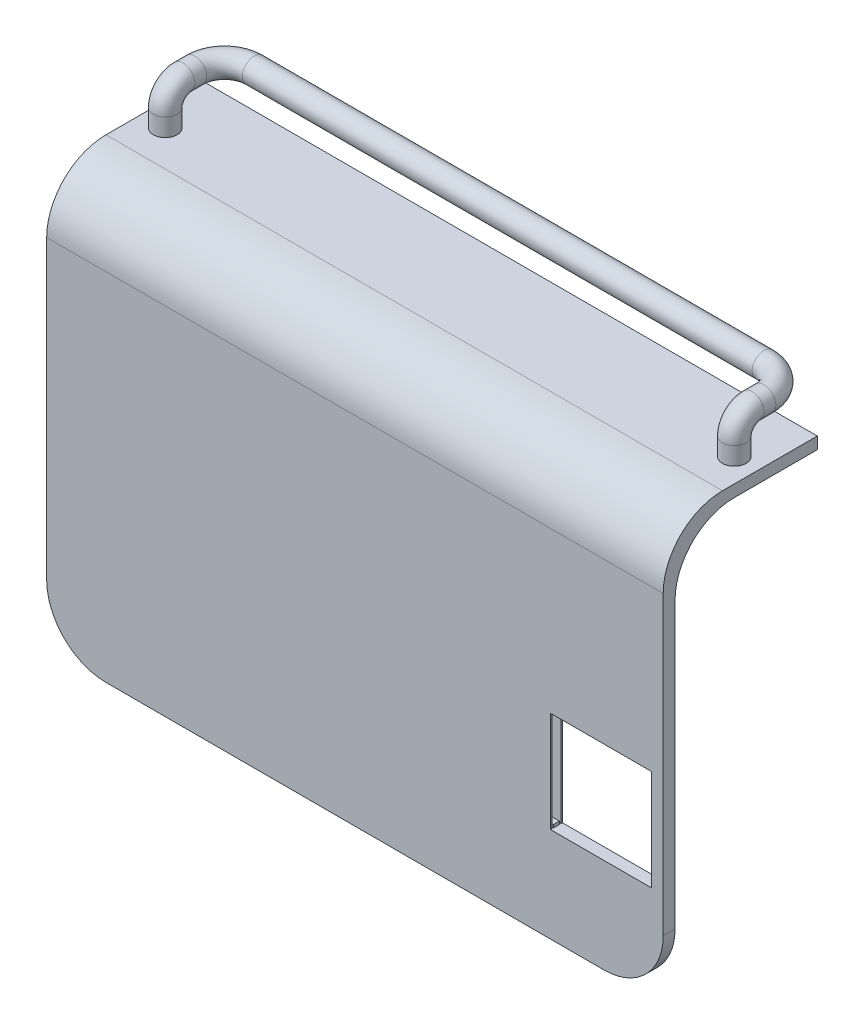
ISO-10303-21;
HEADER;
FILE_DESCRIPTION(('STEP AP214'),'2;1');
FILE_NAME('part.step','',(''),(''),'','','');
FILE_SCHEMA(('AUTOMOTIVE_DESIGN { 1 0 10303 214 1 1 1 1 }'));
ENDSEC;
DATA;
#1=APPLICATION_CONTEXT('core data for automotive mechanical design processes');
#2=APPLICATION_PROTOCOL_DEFINITION('international standard','automotive_design',2000,#1);
#3=PRODUCT_CONTEXT('',#1,'mechanical');
#4=PRODUCT('Part','Part','',(#3));
#5=PRODUCT_RELATED_PRODUCT_CATEGORY('part','',(#4));
#6=PRODUCT_DEFINITION_FORMATION('','',#4);
#7=PRODUCT_DEFINITION_CONTEXT('part definition',#1,'design');
#8=PRODUCT_DEFINITION('design','',#6,#7);
#9=PRODUCT_DEFINITION_SHAPE('','',#8);
#10=(LENGTH_UNIT() NAMED_UNIT(*) SI_UNIT(.MILLI.,.METRE.));
#11=(NAMED_UNIT(*) PLANE_ANGLE_UNIT() SI_UNIT($,.RADIAN.));
#12=(NAMED_UNIT(*) SI_UNIT($,.STERADIAN.) SOLID_ANGLE_UNIT());
#13=UNCERTAINTY_MEASURE_WITH_UNIT(LENGTH_MEASURE(1.E-05),#10,'distance_accuracy_value','');
#14=(GEOMETRIC_REPRESENTATION_CONTEXT(3) GLOBAL_UNCERTAINTY_ASSIGNED_CONTEXT((#13)) GLOBAL_UNIT_ASSIGNED_CONTEXT((#10,
#11,#12)) REPRESENTATION_CONTEXT('',''));
#15=CARTESIAN_POINT('',(0.,0.,0.));
#16=DIRECTION('',(0.,0.,1.));
#17=DIRECTION('',(1.,0.,0.));
#18=AXIS2_PLACEMENT_3D('',#15,#16,#17);
#19=CARTESIAN_POINT('',(330.,0.,240.));
#20=DIRECTION('',(1.,0.,0.));
#21=DIRECTION('',(0.,0.,-1.));
#22=AXIS2_PLACEMENT_3D('',#19,#20,#21);
#23=PLANE('',#22);
#24=DIRECTION('',(0.,1.,0.));
#25=VECTOR('',#24,1.);
#26=CARTESIAN_POINT('',(330.,-600.,242.5));
#27=LINE('',#26,#25);
#28=CARTESIAN_POINT('',(330.,-600.,242.5));
#29=VERTEX_POINT('',#28);
#30=CARTESIAN_POINT('',(330.,-430.,242.5));
#31=VERTEX_POINT('',#30);
#32=EDGE_CURVE('E49',#29,#31,#27,.T.);
#33=ORIENTED_EDGE('',*,*,#32,.F.);
#34=DIRECTION('',(0.,0.,1.));
#35=VECTOR('',#34,1.);
#36=CARTESIAN_POINT('',(330.,-600.,240.));
#37=LINE('',#36,#35);
#38=CARTESIAN_POINT('',(330.,-600.,240.));
#39=VERTEX_POINT('',#38);
#40=EDGE_CURVE('E343',#39,#29,#37,.T.);
#41=ORIENTED_EDGE('',*,*,#40,.F.);
#42=DIRECTION('',(0.,1.,0.));
#43=VECTOR('',#42,1.);
#44=CARTESIAN_POINT('',(330.,0.,240.));
#45=LINE('',#44,#43);
#46=CARTESIAN_POINT('',(330.,-430.,240.));
#47=VERTEX_POINT('',#46);
#48=EDGE_CURVE('E330',#39,#47,#45,.T.);
#49=ORIENTED_EDGE('',*,*,#48,.T.);
#50=DIRECTION('',(0.,0.,1.));
#51=VECTOR('',#50,1.);
#52=CARTESIAN_POINT('',(330.,-430.,240.));
#53=LINE('',#52,#51);
#54=EDGE_CURVE('E349',#47,#31,#53,.T.);
#55=ORIENTED_EDGE('',*,*,#54,.T.);
#56=EDGE_LOOP('',(#33,#41,#49,#55));
#57=FACE_BOUND('',#56,.T.);
#58=ADVANCED_FACE('F34',(#57),#23,.T.);
#59=DIRECTION('',(0.,-1.,0.));
#60=VECTOR('',#59,1.);
#61=CARTESIAN_POINT('',(330.,-595.,245.));
#62=LINE('',#61,#60);
#63=CARTESIAN_POINT('',(330.,-595.,245.));
#64=VERTEX_POINT('',#63);
#65=CARTESIAN_POINT('',(330.,-600.,245.));
#66=VERTEX_POINT('',#65);
#67=EDGE_CURVE('E244',#64,#66,#62,.T.);
#68=ORIENTED_EDGE('',*,*,#67,.F.);
#69=DIRECTION('',(0.,0.,-1.));
#70=VECTOR('',#69,1.);
#71=CARTESIAN_POINT('',(330.,-595.,255.));
#72=LINE('',#71,#70);
#73=CARTESIAN_POINT('',(330.,-595.,255.));
#74=VERTEX_POINT('',#73);
#75=EDGE_CURVE('E284',#74,#64,#72,.T.);
#76=ORIENTED_EDGE('',*,*,#75,.F.);
#77=DIRECTION('',(0.,1.,0.));
#78=VECTOR('',#77,1.);
#79=CARTESIAN_POINT('',(330.,-600.,255.));
#80=LINE('',#79,#78);
#81=CARTESIAN_POINT('',(330.,-600.,255.));
#82=VERTEX_POINT('',#81);
#83=EDGE_CURVE('E281',#82,#74,#80,.T.);
#84=ORIENTED_EDGE('',*,*,#83,.F.);
#85=EDGE_CURVE('E347',#66,#82,#37,.T.);
#86=ORIENTED_EDGE('',*,*,#85,.F.);
#87=EDGE_LOOP('',(#68,#76,#84,#86));
#88=FACE_BOUND('',#87,.T.);
#89=ADVANCED_FACE('F527',(#88),#23,.T.);
#90=DIRECTION('',(0.,-1.,0.));
#91=VECTOR('',#90,1.);
#92=CARTESIAN_POINT('',(330.,-430.,257.5));
#93=LINE('',#92,#91);
#94=CARTESIAN_POINT('',(330.,-430.,257.5));
#95=VERTEX_POINT('',#94);
#96=CARTESIAN_POINT('',(330.,-600.,257.5));
#97=VERTEX_POINT('',#96);
#98=EDGE_CURVE('E278',#95,#97,#93,.T.);
#99=ORIENTED_EDGE('',*,*,#98,.F.);
#100=CARTESIAN_POINT('',(330.,-430.,260.));
#101=VERTEX_POINT('',#100);
#102=EDGE_CURVE('E353',#95,#101,#53,.T.);
#103=ORIENTED_EDGE('',*,*,#102,.T.);
#104=DIRECTION('',(0.,1.,0.));
#105=VECTOR('',#104,1.);
#106=CARTESIAN_POINT('',(330.,0.,260.));
#107=LINE('',#106,#105);
#108=CARTESIAN_POINT('',(330.,-600.,260.));
#109=VERTEX_POINT('',#108);
#110=EDGE_CURVE('E325',#109,#101,#107,.T.);
#111=ORIENTED_EDGE('',*,*,#110,.F.);
#112=EDGE_CURVE('E348',#97,#109,#37,.T.);
#113=ORIENTED_EDGE('',*,*,#112,.F.);
#114=EDGE_LOOP('',(#99,#103,#111,#113));
#115=FACE_BOUND('',#114,.T.);
#116=ADVANCED_FACE('F535',(#115),#23,.T.);
#117=CARTESIAN_POINT('',(520.,-730.,240.));
#118=DIRECTION('',(0.,0.,1.));
#119=DIRECTION('',(1.,0.,0.));
#120=AXIS2_PLACEMENT_3D('',#117,#118,#119);
#121=PLANE('',#120);
#122=DIRECTION('',(-1.,0.,0.));
#123=VECTOR('',#122,1.);
#124=CARTESIAN_POINT('',(0.,-600.,240.));
#125=LINE('',#124,#123);
#126=CARTESIAN_POINT('',(500.,-600.,240.));
#127=VERTEX_POINT('',#126);
#128=EDGE_CURVE('E322',#127,#39,#125,.T.);
#129=ORIENTED_EDGE('',*,*,#128,.F.);
#130=DIRECTION('',(0.,-1.,0.));
#131=VECTOR('',#130,1.);
#132=CARTESIAN_POINT('',(500.,0.,240.));
#133=LINE('',#132,#131);
#134=CARTESIAN_POINT('',(500.,-430.,240.));
#135=VERTEX_POINT('',#134);
#136=EDGE_CURVE('E324',#135,#127,#133,.T.);
#137=ORIENTED_EDGE('',*,*,#136,.F.);
#138=DIRECTION('',(1.,0.,0.));
#139=VECTOR('',#138,1.);
#140=CARTESIAN_POINT('',(0.,-430.,240.));
#141=LINE('',#140,#139);
#142=EDGE_CURVE('E327',#47,#135,#141,.T.);
#143=ORIENTED_EDGE('',*,*,#142,.F.);
#144=ORIENTED_EDGE('',*,*,#48,.F.);
#145=EDGE_LOOP('',(#129,#137,#143,#144));
#146=FACE_BOUND('',#145,.T.);
#147=DIRECTION('',(1.,0.,0.));
#148=VECTOR('',#147,1.);
#149=CARTESIAN_POINT('',(520.,-730.,240.));
#150=LINE('',#149,#148);
#151=CARTESIAN_POINT('',(-491.414284285429,-730.,240.));
#152=VERTEX_POINT('',#151);
#153=CARTESIAN_POINT('',(491.414284285429,-730.,240.));
#154=VERTEX_POINT('',#153);
#155=EDGE_CURVE('E364',#152,#154,#150,.T.);
#156=ORIENTED_EDGE('',*,*,#155,.F.);
#157=CARTESIAN_POINT('',(-420.,-660.,240.));
#158=DIRECTION('',(0.,0.,1.));
#159=DIRECTION('',(1.,0.,0.));
#160=AXIS2_PLACEMENT_3D('',#157,#158,#159);
#161=CIRCLE('',#160,100.);
#162=CARTESIAN_POINT('',(-520.,-660.,240.));
#163=VERTEX_POINT('',#162);
#164=EDGE_CURVE('E453',#152,#163,#161,.F.);
#165=ORIENTED_EDGE('',*,*,#164,.T.);
#166=DIRECTION('',(0.,1.,0.));
#167=VECTOR('',#166,1.);
#168=CARTESIAN_POINT('',(-520.,-730.,240.));
#169=LINE('',#168,#167);
#170=CARTESIAN_POINT('',(-520.,-180.,240.));
#171=VERTEX_POINT('',#170);
#172=EDGE_CURVE('E371',#163,#171,#169,.T.);
#173=ORIENTED_EDGE('',*,*,#172,.T.);
#174=DIRECTION('',(-1.,0.,0.));
#175=VECTOR('',#174,1.);
#176=CARTESIAN_POINT('',(520.,-180.,240.));
#177=LINE('',#176,#175);
#178=CARTESIAN_POINT('',(520.,-180.,240.));
#179=VERTEX_POINT('',#178);
#180=EDGE_CURVE('E314',#179,#171,#177,.T.);
#181=ORIENTED_EDGE('',*,*,#180,.F.);
#182=DIRECTION('',(0.,1.,0.));
#183=VECTOR('',#182,1.);
#184=CARTESIAN_POINT('',(520.,-730.,240.));
#185=LINE('',#184,#183);
#186=CARTESIAN_POINT('',(520.,-660.,240.));
#187=VERTEX_POINT('',#186);
#188=EDGE_CURVE('E369',#187,#179,#185,.T.);
#189=ORIENTED_EDGE('',*,*,#188,.F.);
#190=CARTESIAN_POINT('',(420.,-660.,240.));
#191=DIRECTION('',(0.,0.,1.));
#192=DIRECTION('',(1.,0.,0.));
#193=AXIS2_PLACEMENT_3D('',#190,#191,#192);
#194=CIRCLE('',#193,100.);
#195=EDGE_CURVE('E451',#187,#154,#194,.F.);
#196=ORIENTED_EDGE('',*,*,#195,.T.);
#197=EDGE_LOOP('',(#156,#165,#173,#181,#189,#196));
#198=FACE_BOUND('',#197,.T.);
#199=ADVANCED_FACE('F487',(#146,#198),#121,.F.);
#200=CARTESIAN_POINT('',(520.,-80.0000000000001,260.));
#201=DIRECTION('',(0.,0.,-1.));
#202=DIRECTION('',(-1.,0.,0.));
#203=AXIS2_PLACEMENT_3D('',#200,#201,#202);
#204=PLANE('',#203);
#205=DIRECTION('',(0.,1.,0.));
#206=VECTOR('',#205,1.);
#207=CARTESIAN_POINT('',(-520.,-80.0000000000001,260.));
#208=LINE('',#207,#206);
#209=CARTESIAN_POINT('',(-520.,-660.,260.));
#210=VERTEX_POINT('',#209);
#211=CARTESIAN_POINT('',(-520.,-160.,260.));
#212=VERTEX_POINT('',#211);
#213=EDGE_CURVE('E390',#210,#212,#208,.T.);
#214=ORIENTED_EDGE('',*,*,#213,.F.);
#215=CARTESIAN_POINT('',(-420.,-660.,260.));
#216=DIRECTION('',(0.,0.,-1.));
#217=DIRECTION('',(-1.,0.,0.));
#218=AXIS2_PLACEMENT_3D('',#215,#216,#217);
#219=CIRCLE('',#218,100.);
#220=CARTESIAN_POINT('',(-420.,-760.,260.));
#221=VERTEX_POINT('',#220);
#222=EDGE_CURVE('E42',#210,#221,#219,.F.);
#223=ORIENTED_EDGE('',*,*,#222,.T.);
#224=DIRECTION('',(-1.,0.,0.));
#225=VECTOR('',#224,1.);
#226=CARTESIAN_POINT('',(-520.,-760.,260.));
#227=LINE('',#226,#225);
#228=CARTESIAN_POINT('',(420.,-760.,260.));
#229=VERTEX_POINT('',#228);
#230=EDGE_CURVE('E358',#229,#221,#227,.T.);
#231=ORIENTED_EDGE('',*,*,#230,.F.);
#232=CARTESIAN_POINT('',(420.,-660.,260.));
#233=DIRECTION('',(0.,0.,-1.));
#234=DIRECTION('',(-1.,0.,0.));
#235=AXIS2_PLACEMENT_3D('',#232,#233,#234);
#236=CIRCLE('',#235,100.);
#237=CARTESIAN_POINT('',(520.,-660.,260.));
#238=VERTEX_POINT('',#237);
#239=EDGE_CURVE('E57',#229,#238,#236,.F.);
#240=ORIENTED_EDGE('',*,*,#239,.T.);
#241=DIRECTION('',(0.,1.,0.));
#242=VECTOR('',#241,1.);
#243=CARTESIAN_POINT('',(520.,-80.0000000000001,260.));
#244=LINE('',#243,#242);
#245=CARTESIAN_POINT('',(520.,-160.,260.));
#246=VERTEX_POINT('',#245);
#247=EDGE_CURVE('E392',#238,#246,#244,.T.);
#248=ORIENTED_EDGE('',*,*,#247,.T.);
#249=DIRECTION('',(-1.,0.,0.));
#250=VECTOR('',#249,1.);
#251=CARTESIAN_POINT('',(-520.,-160.,260.));
#252=LINE('',#251,#250);
#253=EDGE_CURVE('E425',#246,#212,#252,.T.);
#254=ORIENTED_EDGE('',*,*,#253,.T.);
#255=EDGE_LOOP('',(#214,#223,#231,#240,#248,#254));
#256=FACE_BOUND('',#255,.T.);
#257=DIRECTION('',(-1.,0.,0.));
#258=VECTOR('',#257,1.);
#259=CARTESIAN_POINT('',(0.,-600.,260.));
#260=LINE('',#259,#258);
#261=CARTESIAN_POINT('',(500.,-600.,260.));
#262=VERTEX_POINT('',#261);
#263=EDGE_CURVE('E321',#262,#109,#260,.T.);
#264=ORIENTED_EDGE('',*,*,#263,.T.);
#265=ORIENTED_EDGE('',*,*,#110,.T.);
#266=DIRECTION('',(1.,0.,0.));
#267=VECTOR('',#266,1.);
#268=CARTESIAN_POINT('',(0.,-430.,260.));
#269=LINE('',#268,#267);
#270=CARTESIAN_POINT('',(500.,-430.,260.));
#271=VERTEX_POINT('',#270);
#272=EDGE_CURVE('E338',#101,#271,#269,.T.);
#273=ORIENTED_EDGE('',*,*,#272,.T.);
#274=DIRECTION('',(0.,-1.,0.));
#275=VECTOR('',#274,1.);
#276=CARTESIAN_POINT('',(500.,0.,260.));
#277=LINE('',#276,#275);
#278=EDGE_CURVE('E335',#271,#262,#277,.T.);
#279=ORIENTED_EDGE('',*,*,#278,.T.);
#280=EDGE_LOOP('',(#264,#265,#273,#279));
#281=FACE_BOUND('',#280,.T.);
#282=ADVANCED_FACE('F459',(#256,#281),#204,.F.);
#283=CARTESIAN_POINT('',(0.,-730.,0.));
#284=DIRECTION('',(0.,1.,0.));
#285=DIRECTION('',(0.,0.,1.));
#286=AXIS2_PLACEMENT_3D('',#283,#284,#285);
#287=PLANE('',#286);
#288=DIRECTION('',(1.,0.,0.));
#289=VECTOR('',#288,1.);
#290=CARTESIAN_POINT('',(520.,-730.,250.));
#291=LINE('',#290,#289);
#292=CARTESIAN_POINT('',(-491.414284285429,-730.,250.));
#293=VERTEX_POINT('',#292);
#294=CARTESIAN_POINT('',(491.414284285429,-730.,250.));
#295=VERTEX_POINT('',#294);
#296=EDGE_CURVE('E346',#293,#295,#291,.T.);
#297=ORIENTED_EDGE('',*,*,#296,.F.);
#298=DIRECTION('',(0.,0.,-1.));
#299=VECTOR('',#298,1.);
#300=CARTESIAN_POINT('',(-491.414284285429,-730.,250.));
#301=LINE('',#300,#299);
#302=EDGE_CURVE('E449',#293,#152,#301,.T.);
#303=ORIENTED_EDGE('',*,*,#302,.T.);
#304=ORIENTED_EDGE('',*,*,#155,.T.);
#305=DIRECTION('',(0.,0.,1.));
#306=VECTOR('',#305,1.);
#307=CARTESIAN_POINT('',(491.414284285429,-730.,240.));
#308=LINE('',#307,#306);
#309=EDGE_CURVE('E447',#154,#295,#308,.T.);
#310=ORIENTED_EDGE('',*,*,#309,.T.);
#311=EDGE_LOOP('',(#297,#303,#304,#310));
#312=FACE_BOUND('',#311,.T.);
#313=ADVANCED_FACE('F476',(#312),#287,.F.);
#314=CARTESIAN_POINT('',(0.,-80.0000000000001,0.));
#315=DIRECTION('',(0.,1.,0.));
#316=DIRECTION('',(0.,0.,1.));
#317=AXIS2_PLACEMENT_3D('',#314,#315,#316);
#318=PLANE('',#317);
#319=DIRECTION('',(0.,0.,1.));
#320=VECTOR('',#319,1.);
#321=CARTESIAN_POINT('',(520.,-80.0000000000001,260.));
#322=LINE('',#321,#320);
#323=CARTESIAN_POINT('',(520.,-80.0000000000001,0.));
#324=VERTEX_POINT('',#323);
#325=CARTESIAN_POINT('',(520.,-80.0000000000001,140.));
#326=VERTEX_POINT('',#325);
#327=EDGE_CURVE('E377',#324,#326,#322,.T.);
#328=ORIENTED_EDGE('',*,*,#327,.T.);
#329=DIRECTION('',(-1.,0.,0.));
#330=VECTOR('',#329,1.);
#331=CARTESIAN_POINT('',(520.,-80.,140.));
#332=LINE('',#331,#330);
#333=CARTESIAN_POINT('',(-520.,-80.0000000000001,140.));
#334=VERTEX_POINT('',#333);
#335=EDGE_CURVE('E319',#326,#334,#332,.T.);
#336=ORIENTED_EDGE('',*,*,#335,.T.);
#337=DIRECTION('',(0.,0.,-1.));
#338=VECTOR('',#337,1.);
#339=CARTESIAN_POINT('',(-520.,-80.0000000000001,260.));
#340=LINE('',#339,#338);
#341=CARTESIAN_POINT('',(-520.,-80.0000000000001,0.));
#342=VERTEX_POINT('',#341);
#343=EDGE_CURVE('E380',#334,#342,#340,.T.);
#344=ORIENTED_EDGE('',*,*,#343,.T.);
#345=DIRECTION('',(1.,0.,0.));
#346=VECTOR('',#345,1.);
#347=CARTESIAN_POINT('',(0.,-80.0000000000001,0.));
#348=LINE('',#347,#346);
#349=EDGE_CURVE('E374',#342,#324,#348,.T.);
#350=ORIENTED_EDGE('',*,*,#349,.T.);
#351=EDGE_LOOP('',(#328,#336,#344,#350));
#352=FACE_BOUND('',#351,.T.);
#353=ADVANCED_FACE('F497',(#352),#318,.F.);
#354=CARTESIAN_POINT('',(0.,0.,0.));
#355=DIRECTION('',(-1.,0.,0.));
#356=DIRECTION('',(0.,0.,1.));
#357=AXIS2_PLACEMENT_3D('',#354,#355,#356);
#358=CYLINDRICAL_SURFACE('',#357,20.);
#359=CARTESIAN_POINT('',(-430.,0.,0.));
#360=DIRECTION('',(1.,0.,0.));
#361=DIRECTION('',(0.,1.,0.));
#362=AXIS2_PLACEMENT_3D('',#359,#360,#361);
#363=CIRCLE('',#362,20.);
#364=CARTESIAN_POINT('',(-430.,0.,-20.));
#365=VERTEX_POINT('',#364);
#366=EDGE_CURVE('E411',#365,#365,#363,.T.);
#367=ORIENTED_EDGE('',*,*,#366,.T.);
#368=EDGE_LOOP('',(#367));
#369=FACE_BOUND('',#368,.T.);
#370=CARTESIAN_POINT('',(430.,0.,0.));
#371=DIRECTION('',(1.,0.,0.));
#372=DIRECTION('',(0.,1.,0.));
#373=AXIS2_PLACEMENT_3D('',#370,#371,#372);
#374=CIRCLE('',#373,20.);
#375=CARTESIAN_POINT('',(430.,0.,-20.));
#376=VERTEX_POINT('',#375);
#377=EDGE_CURVE('E398',#376,#376,#374,.F.);
#378=ORIENTED_EDGE('',*,*,#377,.T.);
#379=EDGE_LOOP('',(#378));
#380=FACE_BOUND('',#379,.T.);
#381=ADVANCED_FACE('F621',(#369,#380),#358,.T.);
#382=CARTESIAN_POINT('',(-430.,0.,50.));
#383=DIRECTION('',(0.,1.,0.));
#384=DIRECTION('',(0.,0.,1.));
#385=AXIS2_PLACEMENT_3D('',#382,#383,#384);
#386=TOROIDAL_SURFACE('',#385,50.,20.);
#387=CARTESIAN_POINT('',(-480.,0.,50.));
#388=DIRECTION('',(0.,0.,-1.));
#389=DIRECTION('',(0.,1.,0.));
#390=AXIS2_PLACEMENT_3D('',#387,#388,#389);
#391=CIRCLE('',#390,20.);
#392=CARTESIAN_POINT('',(-500.,0.,50.));
#393=VERTEX_POINT('',#392);
#394=EDGE_CURVE('E416',#393,#393,#391,.T.);
#395=CARTESIAN_POINT('',(-430.,0.,50.));
#396=DIRECTION('',(0.,1.,0.));
#397=DIRECTION('',(0.,0.,1.));
#398=AXIS2_PLACEMENT_3D('',#395,#396,#397);
#399=CIRCLE('',#398,70.);
#400=EDGE_CURVE('',#365,#393,#399,.T.);
#401=ORIENTED_EDGE('',*,*,#366,.F.);
#402=ORIENTED_EDGE('',*,*,#394,.T.);
#403=ORIENTED_EDGE('',*,*,#400,.T.);
#404=ORIENTED_EDGE('',*,*,#400,.F.);
#405=EDGE_LOOP('',(#401,#403,#402,#404));
#406=FACE_BOUND('',#405,.T.);
#407=ADVANCED_FACE('F624',(#406),#386,.T.);
#408=CARTESIAN_POINT('',(-480.,0.,50.));
#409=DIRECTION('',(0.,0.,1.));
#410=DIRECTION('',(0.,-1.,0.));
#411=AXIS2_PLACEMENT_3D('',#408,#409,#410);
#412=CYLINDRICAL_SURFACE('',#411,20.);
#413=CARTESIAN_POINT('',(-480.,0.,70.));
#414=DIRECTION('',(0.,0.,-1.));
#415=DIRECTION('',(0.,1.,0.));
#416=AXIS2_PLACEMENT_3D('',#413,#414,#415);
#417=CIRCLE('',#416,20.);
#418=CARTESIAN_POINT('',(-480.,20.,70.));
#419=VERTEX_POINT('',#418);
#420=EDGE_CURVE('E419',#419,#419,#417,.T.);
#421=ORIENTED_EDGE('',*,*,#420,.T.);
#422=EDGE_LOOP('',(#421));
#423=FACE_BOUND('',#422,.T.);
#424=ORIENTED_EDGE('',*,*,#394,.F.);
#425=EDGE_LOOP('',(#424));
#426=FACE_BOUND('',#425,.T.);
#427=ADVANCED_FACE('F628',(#423,#426),#412,.T.);
#428=CARTESIAN_POINT('',(-480.,-30.,70.));
#429=DIRECTION('',(1.,0.,0.));
#430=DIRECTION('',(0.,0.,-1.));
#431=AXIS2_PLACEMENT_3D('',#428,#429,#430);
#432=TOROIDAL_SURFACE('',#431,30.,20.);
#433=CARTESIAN_POINT('',(-480.,-30.,100.));
#434=DIRECTION('',(0.,1.,0.));
#435=DIRECTION('',(0.,0.,1.));
#436=AXIS2_PLACEMENT_3D('',#433,#434,#435);
#437=CIRCLE('',#436,20.);
#438=CARTESIAN_POINT('',(-480.,-29.9999999999999,120.));
#439=VERTEX_POINT('',#438);
#440=EDGE_CURVE('E422',#439,#439,#437,.T.);
#441=CARTESIAN_POINT('',(-480.,-30.,70.));
#442=DIRECTION('',(1.,0.,0.));
#443=DIRECTION('',(0.,0.,-1.));
#444=AXIS2_PLACEMENT_3D('',#441,#442,#443);
#445=CIRCLE('',#444,50.);
#446=EDGE_CURVE('',#419,#439,#445,.T.);
#447=ORIENTED_EDGE('',*,*,#420,.F.);
#448=ORIENTED_EDGE('',*,*,#440,.T.);
#449=ORIENTED_EDGE('',*,*,#446,.T.);
#450=ORIENTED_EDGE('',*,*,#446,.F.);
#451=EDGE_LOOP('',(#447,#449,#448,#450));
#452=FACE_BOUND('',#451,.T.);
#453=ADVANCED_FACE('F632',(#452),#432,.T.);
#454=CARTESIAN_POINT('',(-480.,-30.,100.));
#455=DIRECTION('',(0.,-1.,0.));
#456=DIRECTION('',(0.,0.,-1.));
#457=AXIS2_PLACEMENT_3D('',#454,#455,#456);
#458=CYLINDRICAL_SURFACE('',#457,20.);
#459=CARTESIAN_POINT('',(-480.,-60.0000000000001,100.));
#460=DIRECTION('',(0.,1.,0.));
#461=DIRECTION('',(0.,0.,1.));
#462=AXIS2_PLACEMENT_3D('',#459,#460,#461);
#463=CIRCLE('',#462,20.);
#464=CARTESIAN_POINT('',(-480.,-60.0000000000001,120.));
#465=VERTEX_POINT('',#464);
#466=EDGE_CURVE('E402',#465,#465,#463,.T.);
#467=ORIENTED_EDGE('',*,*,#466,.T.);
#468=EDGE_LOOP('',(#467));
#469=FACE_BOUND('',#468,.T.);
#470=ORIENTED_EDGE('',*,*,#440,.F.);
#471=EDGE_LOOP('',(#470));
#472=FACE_BOUND('',#471,.T.);
#473=ADVANCED_FACE('F609',(#469,#472),#458,.T.);
#474=CARTESIAN_POINT('',(430.,0.,50.));
#475=DIRECTION('',(0.,-1.,0.));
#476=DIRECTION('',(0.,0.,-1.));
#477=AXIS2_PLACEMENT_3D('',#474,#475,#476);
#478=TOROIDAL_SURFACE('',#477,50.,20.);
#479=CARTESIAN_POINT('',(480.,0.,50.));
#480=DIRECTION('',(0.,0.,1.));
#481=DIRECTION('',(0.,1.,0.));
#482=AXIS2_PLACEMENT_3D('',#479,#480,#481);
#483=CIRCLE('',#482,20.);
#484=CARTESIAN_POINT('',(500.,0.,50.));
#485=VERTEX_POINT('',#484);
#486=EDGE_CURVE('E401',#485,#485,#483,.F.);
#487=CARTESIAN_POINT('',(430.,0.,50.));
#488=DIRECTION('',(0.,-1.,0.));
#489=DIRECTION('',(0.,0.,-1.));
#490=AXIS2_PLACEMENT_3D('',#487,#488,#489);
#491=CIRCLE('',#490,70.);
#492=EDGE_CURVE('',#376,#485,#491,.T.);
#493=ORIENTED_EDGE('',*,*,#377,.F.);
#494=ORIENTED_EDGE('',*,*,#486,.T.);
#495=ORIENTED_EDGE('',*,*,#492,.T.);
#496=ORIENTED_EDGE('',*,*,#492,.F.);
#497=EDGE_LOOP('',(#493,#495,#494,#496));
#498=FACE_BOUND('',#497,.T.);
#499=ADVANCED_FACE('F524',(#498),#478,.T.);
#500=CARTESIAN_POINT('',(480.,0.,50.));
#501=DIRECTION('',(0.,0.,1.));
#502=DIRECTION('',(0.,-1.,0.));
#503=AXIS2_PLACEMENT_3D('',#500,#501,#502);
#504=CYLINDRICAL_SURFACE('',#503,20.);
#505=CARTESIAN_POINT('',(480.,0.,70.));
#506=DIRECTION('',(0.,0.,1.));
#507=DIRECTION('',(0.,1.,0.));
#508=AXIS2_PLACEMENT_3D('',#505,#506,#507);
#509=CIRCLE('',#508,20.);
#510=CARTESIAN_POINT('',(480.,20.,70.));
#511=VERTEX_POINT('',#510);
#512=EDGE_CURVE('E405',#511,#511,#509,.F.);
#513=ORIENTED_EDGE('',*,*,#512,.T.);
#514=EDGE_LOOP('',(#513));
#515=FACE_BOUND('',#514,.T.);
#516=ORIENTED_EDGE('',*,*,#486,.F.);
#517=EDGE_LOOP('',(#516));
#518=FACE_BOUND('',#517,.T.);
#519=ADVANCED_FACE('F608',(#515,#518),#504,.T.);
#520=CARTESIAN_POINT('',(480.,-30.,70.));
#521=DIRECTION('',(1.,0.,0.));
#522=DIRECTION('',(0.,0.,-1.));
#523=AXIS2_PLACEMENT_3D('',#520,#521,#522);
#524=TOROIDAL_SURFACE('',#523,30.,20.);
#525=CARTESIAN_POINT('',(480.,-30.,100.));
#526=DIRECTION('',(0.,-1.,0.));
#527=DIRECTION('',(0.,0.,1.));
#528=AXIS2_PLACEMENT_3D('',#525,#526,#527);
#529=CIRCLE('',#528,20.);
#530=CARTESIAN_POINT('',(480.,-29.9999999999999,120.));
#531=VERTEX_POINT('',#530);
#532=EDGE_CURVE('E408',#531,#531,#529,.F.);
#533=CARTESIAN_POINT('',(480.,-30.,70.));
#534=DIRECTION('',(1.,0.,0.));
#535=DIRECTION('',(0.,0.,-1.));
#536=AXIS2_PLACEMENT_3D('',#533,#534,#535);
#537=CIRCLE('',#536,50.);
#538=EDGE_CURVE('',#511,#531,#537,.T.);
#539=ORIENTED_EDGE('',*,*,#512,.F.);
#540=ORIENTED_EDGE('',*,*,#532,.T.);
#541=ORIENTED_EDGE('',*,*,#538,.T.);
#542=ORIENTED_EDGE('',*,*,#538,.F.);
#543=EDGE_LOOP('',(#539,#541,#540,#542));
#544=FACE_BOUND('',#543,.T.);
#545=ADVANCED_FACE('F613',(#544),#524,.T.);
#546=CARTESIAN_POINT('',(480.,-30.,100.));
#547=DIRECTION('',(0.,-1.,0.));
#548=DIRECTION('',(0.,0.,-1.));
#549=AXIS2_PLACEMENT_3D('',#546,#547,#548);
#550=CYLINDRICAL_SURFACE('',#549,20.);
#551=CARTESIAN_POINT('',(480.,-60.0000000000001,100.));
#552=DIRECTION('',(0.,-1.,0.));
#553=DIRECTION('',(0.,0.,1.));
#554=AXIS2_PLACEMENT_3D('',#551,#552,#553);
#555=CIRCLE('',#554,20.);
#556=CARTESIAN_POINT('',(480.,-60.0000000000001,120.));
#557=VERTEX_POINT('',#556);
#558=EDGE_CURVE('E397',#557,#557,#555,.F.);
#559=ORIENTED_EDGE('',*,*,#558,.T.);
#560=EDGE_LOOP('',(#559));
#561=FACE_BOUND('',#560,.T.);
#562=ORIENTED_EDGE('',*,*,#532,.F.);
#563=EDGE_LOOP('',(#562));
#564=FACE_BOUND('',#563,.T.);
#565=ADVANCED_FACE('F522',(#561,#564),#550,.T.);
#566=CARTESIAN_POINT('',(520.,-80.0000000000001,260.));
#567=DIRECTION('',(-1.,0.,0.));
#568=DIRECTION('',(0.,0.,1.));
#569=AXIS2_PLACEMENT_3D('',#566,#567,#568);
#570=PLANE('',#569);
#571=ORIENTED_EDGE('',*,*,#247,.F.);
#572=DIRECTION('',(0.,0.,1.));
#573=VECTOR('',#572,1.);
#574=CARTESIAN_POINT('',(520.,-660.,260.));
#575=LINE('',#574,#573);
#576=EDGE_CURVE('E11',#238,#187,#575,.F.);
#577=ORIENTED_EDGE('',*,*,#576,.T.);
#578=ORIENTED_EDGE('',*,*,#188,.T.);
#579=CARTESIAN_POINT('',(520.,-180.,140.));
#580=DIRECTION('',(-1.,0.,0.));
#581=DIRECTION('',(0.,0.,-1.));
#582=AXIS2_PLACEMENT_3D('',#579,#580,#581);
#583=CIRCLE('',#582,100.);
#584=EDGE_CURVE('E311',#179,#326,#583,.T.);
#585=ORIENTED_EDGE('',*,*,#584,.T.);
#586=ORIENTED_EDGE('',*,*,#327,.F.);
#587=DIRECTION('',(0.,1.,0.));
#588=VECTOR('',#587,1.);
#589=CARTESIAN_POINT('',(520.,-80.0000000000001,0.));
#590=LINE('',#589,#588);
#591=CARTESIAN_POINT('',(520.,-60.0000000000001,0.));
#592=VERTEX_POINT('',#591);
#593=EDGE_CURVE('E394',#324,#592,#590,.T.);
#594=ORIENTED_EDGE('',*,*,#593,.T.);
#595=DIRECTION('',(0.,0.,1.));
#596=VECTOR('',#595,1.);
#597=CARTESIAN_POINT('',(520.,-60.0000000000001,260.));
#598=LINE('',#597,#596);
#599=CARTESIAN_POINT('',(520.,-60.0000000000001,160.));
#600=VERTEX_POINT('',#599);
#601=EDGE_CURVE('E373',#592,#600,#598,.T.);
#602=ORIENTED_EDGE('',*,*,#601,.T.);
#603=CARTESIAN_POINT('',(520.,-160.,160.));
#604=DIRECTION('',(-1.,0.,0.));
#605=DIRECTION('',(0.,0.,1.));
#606=AXIS2_PLACEMENT_3D('',#603,#604,#605);
#607=CIRCLE('',#606,100.);
#608=EDGE_CURVE('E434',#600,#246,#607,.F.);
#609=ORIENTED_EDGE('',*,*,#608,.T.);
#610=EDGE_LOOP('',(#571,#577,#578,#585,#586,#594,#602,#609));
#611=FACE_BOUND('',#610,.T.);
#612=ADVANCED_FACE('F484',(#611),#570,.F.);
#613=CARTESIAN_POINT('',(-520.,-80.0000000000001,260.));
#614=DIRECTION('',(1.,0.,0.));
#615=DIRECTION('',(0.,0.,-1.));
#616=AXIS2_PLACEMENT_3D('',#613,#614,#615);
#617=PLANE('',#616);
#618=ORIENTED_EDGE('',*,*,#172,.F.);
#619=DIRECTION('',(0.,0.,-1.));
#620=VECTOR('',#619,1.);
#621=CARTESIAN_POINT('',(-520.,-660.,260.));
#622=LINE('',#621,#620);
#623=EDGE_CURVE('E455',#163,#210,#622,.F.);
#624=ORIENTED_EDGE('',*,*,#623,.T.);
#625=ORIENTED_EDGE('',*,*,#213,.T.);
#626=CARTESIAN_POINT('',(-520.,-160.,160.));
#627=DIRECTION('',(1.,0.,0.));
#628=DIRECTION('',(0.,0.,-1.));
#629=AXIS2_PLACEMENT_3D('',#626,#627,#628);
#630=CIRCLE('',#629,100.);
#631=CARTESIAN_POINT('',(-520.,-60.0000000000001,160.));
#632=VERTEX_POINT('',#631);
#633=EDGE_CURVE('E430',#212,#632,#630,.F.);
#634=ORIENTED_EDGE('',*,*,#633,.T.);
#635=DIRECTION('',(0.,0.,-1.));
#636=VECTOR('',#635,1.);
#637=CARTESIAN_POINT('',(-520.,-60.0000000000001,260.));
#638=LINE('',#637,#636);
#639=CARTESIAN_POINT('',(-520.,-60.0000000000001,0.));
#640=VERTEX_POINT('',#639);
#641=EDGE_CURVE('E385',#632,#640,#638,.T.);
#642=ORIENTED_EDGE('',*,*,#641,.T.);
#643=DIRECTION('',(0.,1.,0.));
#644=VECTOR('',#643,1.);
#645=CARTESIAN_POINT('',(-520.,-80.0000000000001,0.));
#646=LINE('',#645,#644);
#647=EDGE_CURVE('E382',#342,#640,#646,.T.);
#648=ORIENTED_EDGE('',*,*,#647,.F.);
#649=ORIENTED_EDGE('',*,*,#343,.F.);
#650=CARTESIAN_POINT('',(-520.,-180.,140.));
#651=DIRECTION('',(-1.,0.,0.));
#652=DIRECTION('',(0.,0.,-1.));
#653=AXIS2_PLACEMENT_3D('',#650,#651,#652);
#654=CIRCLE('',#653,100.);
#655=EDGE_CURVE('E291',#171,#334,#654,.T.);
#656=ORIENTED_EDGE('',*,*,#655,.F.);
#657=EDGE_LOOP('',(#618,#624,#625,#634,#642,#648,#649,#656));
#658=FACE_BOUND('',#657,.T.);
#659=ADVANCED_FACE('F514',(#658),#617,.F.);
#660=CARTESIAN_POINT('',(0.,-80.0000000000001,0.));
#661=DIRECTION('',(0.,0.,1.));
#662=DIRECTION('',(1.,0.,0.));
#663=AXIS2_PLACEMENT_3D('',#660,#661,#662);
#664=PLANE('',#663);
#665=DIRECTION('',(1.,0.,0.));
#666=VECTOR('',#665,1.);
#667=CARTESIAN_POINT('',(0.,-60.0000000000001,0.));
#668=LINE('',#667,#666);
#669=EDGE_CURVE('E378',#640,#592,#668,.T.);
#670=ORIENTED_EDGE('',*,*,#669,.T.);
#671=ORIENTED_EDGE('',*,*,#593,.F.);
#672=ORIENTED_EDGE('',*,*,#349,.F.);
#673=ORIENTED_EDGE('',*,*,#647,.T.);
#674=EDGE_LOOP('',(#670,#671,#672,#673));
#675=FACE_BOUND('',#674,.T.);
#676=ADVANCED_FACE('F501',(#675),#664,.F.);
#677=CARTESIAN_POINT('',(0.,-60.0000000000001,0.));
#678=DIRECTION('',(0.,1.,0.));
#679=DIRECTION('',(0.,0.,1.));
#680=AXIS2_PLACEMENT_3D('',#677,#678,#679);
#681=PLANE('',#680);
#682=ORIENTED_EDGE('',*,*,#466,.F.);
#683=EDGE_LOOP('',(#682));
#684=FACE_BOUND('',#683,.T.);
#685=ORIENTED_EDGE('',*,*,#558,.F.);
#686=EDGE_LOOP('',(#685));
#687=FACE_BOUND('',#686,.T.);
#688=ORIENTED_EDGE('',*,*,#641,.F.);
#689=DIRECTION('',(-1.,0.,0.));
#690=VECTOR('',#689,1.);
#691=CARTESIAN_POINT('',(520.,-60.0000000000001,160.));
#692=LINE('',#691,#690);
#693=EDGE_CURVE('E432',#632,#600,#692,.F.);
#694=ORIENTED_EDGE('',*,*,#693,.T.);
#695=ORIENTED_EDGE('',*,*,#601,.F.);
#696=ORIENTED_EDGE('',*,*,#669,.F.);
#697=EDGE_LOOP('',(#688,#694,#695,#696));
#698=FACE_BOUND('',#697,.T.);
#699=ADVANCED_FACE('F506',(#684,#687,#698),#681,.T.);
#700=CARTESIAN_POINT('',(520.,-760.,250.));
#701=DIRECTION('',(0.,0.,1.));
#702=DIRECTION('',(1.,0.,0.));
#703=AXIS2_PLACEMENT_3D('',#700,#701,#702);
#704=PLANE('',#703);
#705=DIRECTION('',(1.,0.,0.));
#706=VECTOR('',#705,1.);
#707=CARTESIAN_POINT('',(520.,-760.,250.));
#708=LINE('',#707,#706);
#709=CARTESIAN_POINT('',(-420.,-760.,250.));
#710=VERTEX_POINT('',#709);
#711=CARTESIAN_POINT('',(420.,-760.,250.));
#712=VERTEX_POINT('',#711);
#713=EDGE_CURVE('E361',#710,#712,#708,.T.);
#714=ORIENTED_EDGE('',*,*,#713,.F.);
#715=CARTESIAN_POINT('',(-420.,-660.,250.));
#716=DIRECTION('',(0.,0.,1.));
#717=DIRECTION('',(1.,0.,0.));
#718=AXIS2_PLACEMENT_3D('',#715,#716,#717);
#719=CIRCLE('',#718,100.);
#720=EDGE_CURVE('E445',#710,#293,#719,.F.);
#721=ORIENTED_EDGE('',*,*,#720,.T.);
#722=ORIENTED_EDGE('',*,*,#296,.T.);
#723=CARTESIAN_POINT('',(420.,-660.,250.));
#724=DIRECTION('',(0.,0.,1.));
#725=DIRECTION('',(1.,0.,0.));
#726=AXIS2_PLACEMENT_3D('',#723,#724,#725);
#727=CIRCLE('',#726,100.);
#728=EDGE_CURVE('E443',#295,#712,#727,.F.);
#729=ORIENTED_EDGE('',*,*,#728,.T.);
#730=EDGE_LOOP('',(#714,#721,#722,#729));
#731=FACE_BOUND('',#730,.T.);
#732=ADVANCED_FACE('F473',(#731),#704,.F.);
#733=CARTESIAN_POINT('',(0.,-760.,0.));
#734=DIRECTION('',(0.,1.,0.));
#735=DIRECTION('',(0.,0.,1.));
#736=AXIS2_PLACEMENT_3D('',#733,#734,#735);
#737=PLANE('',#736);
#738=ORIENTED_EDGE('',*,*,#230,.T.);
#739=DIRECTION('',(0.,0.,-1.));
#740=VECTOR('',#739,1.);
#741=CARTESIAN_POINT('',(-420.,-760.,0.));
#742=LINE('',#741,#740);
#743=EDGE_CURVE('E440',#221,#710,#742,.T.);
#744=ORIENTED_EDGE('',*,*,#743,.T.);
#745=ORIENTED_EDGE('',*,*,#713,.T.);
#746=DIRECTION('',(0.,0.,1.));
#747=VECTOR('',#746,1.);
#748=CARTESIAN_POINT('',(420.,-760.,0.));
#749=LINE('',#748,#747);
#750=EDGE_CURVE('E437',#712,#229,#749,.T.);
#751=ORIENTED_EDGE('',*,*,#750,.T.);
#752=EDGE_LOOP('',(#738,#744,#745,#751));
#753=FACE_BOUND('',#752,.T.);
#754=ADVANCED_FACE('F465',(#753),#737,.F.);
#755=CARTESIAN_POINT('',(0.,-600.,240.));
#756=DIRECTION('',(0.,1.,0.));
#757=DIRECTION('',(0.,0.,1.));
#758=AXIS2_PLACEMENT_3D('',#755,#756,#757);
#759=PLANE('',#758);
#760=ORIENTED_EDGE('',*,*,#263,.F.);
#761=DIRECTION('',(0.,0.,1.));
#762=VECTOR('',#761,1.);
#763=CARTESIAN_POINT('',(500.,-600.,240.));
#764=LINE('',#763,#762);
#765=EDGE_CURVE('E332',#127,#262,#764,.T.);
#766=ORIENTED_EDGE('',*,*,#765,.F.);
#767=ORIENTED_EDGE('',*,*,#128,.T.);
#768=ORIENTED_EDGE('',*,*,#40,.T.);
#769=DIRECTION('',(1.,0.,0.));
#770=VECTOR('',#769,1.);
#771=CARTESIAN_POINT('',(110.,-600.,242.5));
#772=LINE('',#771,#770);
#773=CARTESIAN_POINT('',(110.,-600.,242.5));
#774=VERTEX_POINT('',#773);
#775=EDGE_CURVE('E294',#774,#29,#772,.T.);
#776=ORIENTED_EDGE('',*,*,#775,.F.);
#777=DIRECTION('',(0.,0.,-1.));
#778=VECTOR('',#777,1.);
#779=CARTESIAN_POINT('',(110.,-600.,245.));
#780=LINE('',#779,#778);
#781=CARTESIAN_POINT('',(110.,-600.,245.));
#782=VERTEX_POINT('',#781);
#783=EDGE_CURVE('E266',#782,#774,#780,.T.);
#784=ORIENTED_EDGE('',*,*,#783,.F.);
#785=DIRECTION('',(1.,0.,0.));
#786=VECTOR('',#785,1.);
#787=CARTESIAN_POINT('',(110.,-600.,245.));
#788=LINE('',#787,#786);
#789=EDGE_CURVE('E296',#782,#66,#788,.T.);
#790=ORIENTED_EDGE('',*,*,#789,.T.);
#791=ORIENTED_EDGE('',*,*,#85,.T.);
#792=DIRECTION('',(1.,0.,0.));
#793=VECTOR('',#792,1.);
#794=CARTESIAN_POINT('',(110.,-600.,255.));
#795=LINE('',#794,#793);
#796=CARTESIAN_POINT('',(110.,-600.,255.));
#797=VERTEX_POINT('',#796);
#798=EDGE_CURVE('E302',#797,#82,#795,.T.);
#799=ORIENTED_EDGE('',*,*,#798,.F.);
#800=DIRECTION('',(0.,0.,-1.));
#801=VECTOR('',#800,1.);
#802=CARTESIAN_POINT('',(110.,-600.,257.5));
#803=LINE('',#802,#801);
#804=CARTESIAN_POINT('',(110.,-600.,257.5));
#805=VERTEX_POINT('',#804);
#806=EDGE_CURVE('E254',#805,#797,#803,.T.);
#807=ORIENTED_EDGE('',*,*,#806,.F.);
#808=DIRECTION('',(1.,0.,0.));
#809=VECTOR('',#808,1.);
#810=CARTESIAN_POINT('',(110.,-600.,257.5));
#811=LINE('',#810,#809);
#812=EDGE_CURVE('E304',#805,#97,#811,.T.);
#813=ORIENTED_EDGE('',*,*,#812,.T.);
#814=ORIENTED_EDGE('',*,*,#112,.T.);
#815=EDGE_LOOP('',(#760,#766,#767,#768,#776,#784,#790,#791,#799,#807,#813,#814));
#816=FACE_BOUND('',#815,.T.);
#817=ADVANCED_FACE('F541',(#816),#759,.T.);
#818=DIRECTION('',(0.,-1.,0.));
#819=VECTOR('',#818,1.);
#820=CARTESIAN_POINT('',(330.,-435.,245.));
#821=LINE('',#820,#819);
#822=CARTESIAN_POINT('',(330.,-430.,245.));
#823=VERTEX_POINT('',#822);
#824=CARTESIAN_POINT('',(330.,-435.,245.));
#825=VERTEX_POINT('',#824);
#826=EDGE_CURVE('E225',#823,#825,#821,.T.);
#827=ORIENTED_EDGE('',*,*,#826,.F.);
#828=CARTESIAN_POINT('',(330.,-430.,255.));
#829=VERTEX_POINT('',#828);
#830=EDGE_CURVE('E352',#823,#829,#53,.T.);
#831=ORIENTED_EDGE('',*,*,#830,.T.);
#832=DIRECTION('',(0.,1.,0.));
#833=VECTOR('',#832,1.);
#834=CARTESIAN_POINT('',(330.,-430.,255.));
#835=LINE('',#834,#833);
#836=CARTESIAN_POINT('',(330.,-435.,255.));
#837=VERTEX_POINT('',#836);
#838=EDGE_CURVE('E275',#837,#829,#835,.T.);
#839=ORIENTED_EDGE('',*,*,#838,.F.);
#840=DIRECTION('',(0.,0.,1.));
#841=VECTOR('',#840,1.);
#842=CARTESIAN_POINT('',(330.,-435.,255.));
#843=LINE('',#842,#841);
#844=EDGE_CURVE('E273',#825,#837,#843,.T.);
#845=ORIENTED_EDGE('',*,*,#844,.F.);
#846=EDGE_LOOP('',(#827,#831,#839,#845));
#847=FACE_BOUND('',#846,.T.);
#848=ADVANCED_FACE('F530',(#847),#23,.T.);
#849=CARTESIAN_POINT('',(0.,-430.,240.));
#850=DIRECTION('',(0.,-1.,0.));
#851=DIRECTION('',(0.,0.,-1.));
#852=AXIS2_PLACEMENT_3D('',#849,#850,#851);
#853=PLANE('',#852);
#854=ORIENTED_EDGE('',*,*,#272,.F.);
#855=ORIENTED_EDGE('',*,*,#102,.F.);
#856=DIRECTION('',(1.,0.,0.));
#857=VECTOR('',#856,1.);
#858=CARTESIAN_POINT('',(110.,-430.,257.5));
#859=LINE('',#858,#857);
#860=CARTESIAN_POINT('',(110.,-430.,257.5));
#861=VERTEX_POINT('',#860);
#862=EDGE_CURVE('E306',#861,#95,#859,.T.);
#863=ORIENTED_EDGE('',*,*,#862,.F.);
#864=DIRECTION('',(0.,0.,1.));
#865=VECTOR('',#864,1.);
#866=CARTESIAN_POINT('',(110.,-430.,257.5));
#867=LINE('',#866,#865);
#868=CARTESIAN_POINT('',(110.,-430.,255.));
#869=VERTEX_POINT('',#868);
#870=EDGE_CURVE('E248',#869,#861,#867,.T.);
#871=ORIENTED_EDGE('',*,*,#870,.F.);
#872=DIRECTION('',(1.,0.,0.));
#873=VECTOR('',#872,1.);
#874=CARTESIAN_POINT('',(110.,-430.,255.));
#875=LINE('',#874,#873);
#876=EDGE_CURVE('E308',#869,#829,#875,.T.);
#877=ORIENTED_EDGE('',*,*,#876,.T.);
#878=ORIENTED_EDGE('',*,*,#830,.F.);
#879=DIRECTION('',(1.,0.,0.));
#880=VECTOR('',#879,1.);
#881=CARTESIAN_POINT('',(110.,-430.,245.));
#882=LINE('',#881,#880);
#883=CARTESIAN_POINT('',(110.,-430.,245.));
#884=VERTEX_POINT('',#883);
#885=EDGE_CURVE('E289',#884,#823,#882,.T.);
#886=ORIENTED_EDGE('',*,*,#885,.F.);
#887=DIRECTION('',(0.,0.,1.));
#888=VECTOR('',#887,1.);
#889=CARTESIAN_POINT('',(110.,-430.,245.));
#890=LINE('',#889,#888);
#891=CARTESIAN_POINT('',(110.,-430.,242.5));
#892=VERTEX_POINT('',#891);
#893=EDGE_CURVE('E230',#892,#884,#890,.T.);
#894=ORIENTED_EDGE('',*,*,#893,.F.);
#895=DIRECTION('',(1.,0.,0.));
#896=VECTOR('',#895,1.);
#897=CARTESIAN_POINT('',(110.,-430.,242.5));
#898=LINE('',#897,#896);
#899=EDGE_CURVE('E292',#892,#31,#898,.T.);
#900=ORIENTED_EDGE('',*,*,#899,.T.);
#901=ORIENTED_EDGE('',*,*,#54,.F.);
#902=ORIENTED_EDGE('',*,*,#142,.T.);
#903=DIRECTION('',(0.,0.,1.));
#904=VECTOR('',#903,1.);
#905=CARTESIAN_POINT('',(500.,-430.,240.));
#906=LINE('',#905,#904);
#907=EDGE_CURVE('E354',#135,#271,#906,.T.);
#908=ORIENTED_EDGE('',*,*,#907,.T.);
#909=EDGE_LOOP('',(#854,#855,#863,#871,#877,#878,#886,#894,#900,#901,#902,#908));
#910=FACE_BOUND('',#909,.T.);
#911=ADVANCED_FACE('F540',(#910),#853,.T.);
#912=CARTESIAN_POINT('',(500.,0.,240.));
#913=DIRECTION('',(-1.,0.,0.));
#914=DIRECTION('',(0.,0.,1.));
#915=AXIS2_PLACEMENT_3D('',#912,#913,#914);
#916=PLANE('',#915);
#917=ORIENTED_EDGE('',*,*,#278,.F.);
#918=ORIENTED_EDGE('',*,*,#907,.F.);
#919=ORIENTED_EDGE('',*,*,#136,.T.);
#920=ORIENTED_EDGE('',*,*,#765,.T.);
#921=EDGE_LOOP('',(#917,#918,#919,#920));
#922=FACE_BOUND('',#921,.T.);
#923=ADVANCED_FACE('F548',(#922),#916,.T.);
#924=CARTESIAN_POINT('',(520.,-180.,140.));
#925=DIRECTION('',(-1.,0.,0.));
#926=DIRECTION('',(0.,0.,1.));
#927=AXIS2_PLACEMENT_3D('',#924,#925,#926);
#928=CYLINDRICAL_SURFACE('',#927,100.);
#929=ORIENTED_EDGE('',*,*,#655,.T.);
#930=ORIENTED_EDGE('',*,*,#335,.F.);
#931=ORIENTED_EDGE('',*,*,#584,.F.);
#932=ORIENTED_EDGE('',*,*,#180,.T.);
#933=EDGE_LOOP('',(#929,#930,#931,#932));
#934=FACE_BOUND('',#933,.T.);
#935=ADVANCED_FACE('F493',(#934),#928,.F.);
#936=CARTESIAN_POINT('',(520.,-160.,160.));
#937=DIRECTION('',(1.,0.,0.));
#938=DIRECTION('',(0.,0.,-1.));
#939=AXIS2_PLACEMENT_3D('',#936,#937,#938);
#940=CYLINDRICAL_SURFACE('',#939,100.);
#941=ORIENTED_EDGE('',*,*,#608,.F.);
#942=ORIENTED_EDGE('',*,*,#693,.F.);
#943=ORIENTED_EDGE('',*,*,#633,.F.);
#944=ORIENTED_EDGE('',*,*,#253,.F.);
#945=EDGE_LOOP('',(#941,#942,#943,#944));
#946=FACE_BOUND('',#945,.T.);
#947=ADVANCED_FACE('F511',(#946),#940,.T.);
#948=CARTESIAN_POINT('',(-420.,-660.,0.));
#949=DIRECTION('',(0.,0.,-1.));
#950=DIRECTION('',(-1.,0.,0.));
#951=AXIS2_PLACEMENT_3D('',#948,#949,#950);
#952=CYLINDRICAL_SURFACE('',#951,100.);
#953=ORIENTED_EDGE('',*,*,#222,.F.);
#954=ORIENTED_EDGE('',*,*,#623,.F.);
#955=ORIENTED_EDGE('',*,*,#164,.F.);
#956=ORIENTED_EDGE('',*,*,#302,.F.);
#957=ORIENTED_EDGE('',*,*,#720,.F.);
#958=ORIENTED_EDGE('',*,*,#743,.F.);
#959=EDGE_LOOP('',(#953,#954,#955,#956,#957,#958));
#960=FACE_BOUND('',#959,.T.);
#961=ADVANCED_FACE('F468',(#960),#952,.T.);
#962=CARTESIAN_POINT('',(420.,-660.,0.));
#963=DIRECTION('',(0.,0.,1.));
#964=DIRECTION('',(1.,0.,0.));
#965=AXIS2_PLACEMENT_3D('',#962,#963,#964);
#966=CYLINDRICAL_SURFACE('',#965,100.);
#967=ORIENTED_EDGE('',*,*,#195,.F.);
#968=ORIENTED_EDGE('',*,*,#576,.F.);
#969=ORIENTED_EDGE('',*,*,#239,.F.);
#970=ORIENTED_EDGE('',*,*,#750,.F.);
#971=ORIENTED_EDGE('',*,*,#728,.F.);
#972=ORIENTED_EDGE('',*,*,#309,.F.);
#973=EDGE_LOOP('',(#967,#968,#969,#970,#971,#972));
#974=FACE_BOUND('',#973,.T.);
#975=ADVANCED_FACE('F36',(#974),#966,.T.);
#976=CARTESIAN_POINT('',(110.,-435.,245.));
#977=DIRECTION('',(0.,0.,1.));
#978=DIRECTION('',(1.,0.,0.));
#979=AXIS2_PLACEMENT_3D('',#976,#977,#978);
#980=PLANE('',#979);
#981=ORIENTED_EDGE('',*,*,#826,.T.);
#982=DIRECTION('',(1.,0.,0.));
#983=VECTOR('',#982,1.);
#984=CARTESIAN_POINT('',(110.,-435.,245.));
#985=LINE('',#984,#983);
#986=CARTESIAN_POINT('',(110.,-435.,245.));
#987=VERTEX_POINT('',#986);
#988=EDGE_CURVE('E218',#987,#825,#985,.T.);
#989=ORIENTED_EDGE('',*,*,#988,.F.);
#990=DIRECTION('',(0.,-1.,0.));
#991=VECTOR('',#990,1.);
#992=CARTESIAN_POINT('',(110.,-435.,245.));
#993=LINE('',#992,#991);
#994=EDGE_CURVE('E222',#884,#987,#993,.T.);
#995=ORIENTED_EDGE('',*,*,#994,.F.);
#996=ORIENTED_EDGE('',*,*,#885,.T.);
#997=EDGE_LOOP('',(#981,#989,#995,#996));
#998=FACE_BOUND('',#997,.T.);
#999=ADVANCED_FACE('F220',(#998),#980,.F.);
#1000=CARTESIAN_POINT('',(110.,-600.,242.5));
#1001=DIRECTION('',(0.,0.,-1.));
#1002=DIRECTION('',(-1.,0.,0.));
#1003=AXIS2_PLACEMENT_3D('',#1000,#1001,#1002);
#1004=PLANE('',#1003);
#1005=ORIENTED_EDGE('',*,*,#32,.T.);
#1006=ORIENTED_EDGE('',*,*,#899,.F.);
#1007=DIRECTION('',(0.,1.,0.));
#1008=VECTOR('',#1007,1.);
#1009=CARTESIAN_POINT('',(110.,-600.,242.5));
#1010=LINE('',#1009,#1008);
#1011=EDGE_CURVE('E269',#774,#892,#1010,.T.);
#1012=ORIENTED_EDGE('',*,*,#1011,.F.);
#1013=ORIENTED_EDGE('',*,*,#775,.T.);
#1014=EDGE_LOOP('',(#1005,#1006,#1012,#1013));
#1015=FACE_BOUND('',#1014,.T.);
#1016=ADVANCED_FACE('F648',(#1015),#1004,.F.);
#1017=CARTESIAN_POINT('',(110.,-595.,245.));
#1018=DIRECTION('',(0.,0.,1.));
#1019=DIRECTION('',(1.,0.,0.));
#1020=AXIS2_PLACEMENT_3D('',#1017,#1018,#1019);
#1021=PLANE('',#1020);
#1022=ORIENTED_EDGE('',*,*,#67,.T.);
#1023=ORIENTED_EDGE('',*,*,#789,.F.);
#1024=DIRECTION('',(0.,-1.,0.));
#1025=VECTOR('',#1024,1.);
#1026=CARTESIAN_POINT('',(110.,-595.,245.));
#1027=LINE('',#1026,#1025);
#1028=CARTESIAN_POINT('',(110.,-595.,245.));
#1029=VERTEX_POINT('',#1028);
#1030=EDGE_CURVE('E263',#1029,#782,#1027,.T.);
#1031=ORIENTED_EDGE('',*,*,#1030,.F.);
#1032=DIRECTION('',(1.,0.,0.));
#1033=VECTOR('',#1032,1.);
#1034=CARTESIAN_POINT('',(110.,-595.,245.));
#1035=LINE('',#1034,#1033);
#1036=EDGE_CURVE('E298',#1029,#64,#1035,.T.);
#1037=ORIENTED_EDGE('',*,*,#1036,.T.);
#1038=EDGE_LOOP('',(#1022,#1023,#1031,#1037));
#1039=FACE_BOUND('',#1038,.T.);
#1040=ADVANCED_FACE('F588',(#1039),#1021,.F.);
#1041=CARTESIAN_POINT('',(110.,-595.,255.));
#1042=DIRECTION('',(0.,-1.,0.));
#1043=DIRECTION('',(0.,0.,-1.));
#1044=AXIS2_PLACEMENT_3D('',#1041,#1042,#1043);
#1045=PLANE('',#1044);
#1046=ORIENTED_EDGE('',*,*,#75,.T.);
#1047=ORIENTED_EDGE('',*,*,#1036,.F.);
#1048=DIRECTION('',(0.,0.,-1.));
#1049=VECTOR('',#1048,1.);
#1050=CARTESIAN_POINT('',(110.,-595.,255.));
#1051=LINE('',#1050,#1049);
#1052=CARTESIAN_POINT('',(110.,-595.,255.));
#1053=VERTEX_POINT('',#1052);
#1054=EDGE_CURVE('E260',#1053,#1029,#1051,.T.);
#1055=ORIENTED_EDGE('',*,*,#1054,.F.);
#1056=DIRECTION('',(1.,0.,0.));
#1057=VECTOR('',#1056,1.);
#1058=CARTESIAN_POINT('',(110.,-595.,255.));
#1059=LINE('',#1058,#1057);
#1060=EDGE_CURVE('E300',#1053,#74,#1059,.T.);
#1061=ORIENTED_EDGE('',*,*,#1060,.T.);
#1062=EDGE_LOOP('',(#1046,#1047,#1055,#1061));
#1063=FACE_BOUND('',#1062,.T.);
#1064=ADVANCED_FACE('F584',(#1063),#1045,.F.);
#1065=CARTESIAN_POINT('',(110.,-600.,255.));
#1066=DIRECTION('',(0.,0.,-1.));
#1067=DIRECTION('',(-1.,0.,0.));
#1068=AXIS2_PLACEMENT_3D('',#1065,#1066,#1067);
#1069=PLANE('',#1068);
#1070=ORIENTED_EDGE('',*,*,#83,.T.);
#1071=ORIENTED_EDGE('',*,*,#1060,.F.);
#1072=DIRECTION('',(0.,1.,0.));
#1073=VECTOR('',#1072,1.);
#1074=CARTESIAN_POINT('',(110.,-600.,255.));
#1075=LINE('',#1074,#1073);
#1076=EDGE_CURVE('E257',#797,#1053,#1075,.T.);
#1077=ORIENTED_EDGE('',*,*,#1076,.F.);
#1078=ORIENTED_EDGE('',*,*,#798,.T.);
#1079=EDGE_LOOP('',(#1070,#1071,#1077,#1078));
#1080=FACE_BOUND('',#1079,.T.);
#1081=ADVANCED_FACE('F580',(#1080),#1069,.F.);
#1082=CARTESIAN_POINT('',(110.,-430.,257.5));
#1083=DIRECTION('',(0.,0.,1.));
#1084=DIRECTION('',(1.,0.,0.));
#1085=AXIS2_PLACEMENT_3D('',#1082,#1083,#1084);
#1086=PLANE('',#1085);
#1087=ORIENTED_EDGE('',*,*,#98,.T.);
#1088=ORIENTED_EDGE('',*,*,#812,.F.);
#1089=DIRECTION('',(0.,-1.,0.));
#1090=VECTOR('',#1089,1.);
#1091=CARTESIAN_POINT('',(110.,-430.,257.5));
#1092=LINE('',#1091,#1090);
#1093=EDGE_CURVE('E251',#861,#805,#1092,.T.);
#1094=ORIENTED_EDGE('',*,*,#1093,.F.);
#1095=ORIENTED_EDGE('',*,*,#862,.T.);
#1096=EDGE_LOOP('',(#1087,#1088,#1094,#1095));
#1097=FACE_BOUND('',#1096,.T.);
#1098=ADVANCED_FACE('F574',(#1097),#1086,.F.);
#1099=CARTESIAN_POINT('',(110.,-430.,255.));
#1100=DIRECTION('',(0.,0.,-1.));
#1101=DIRECTION('',(-1.,0.,0.));
#1102=AXIS2_PLACEMENT_3D('',#1099,#1100,#1101);
#1103=PLANE('',#1102);
#1104=ORIENTED_EDGE('',*,*,#838,.T.);
#1105=ORIENTED_EDGE('',*,*,#876,.F.);
#1106=DIRECTION('',(0.,1.,0.));
#1107=VECTOR('',#1106,1.);
#1108=CARTESIAN_POINT('',(110.,-430.,255.));
#1109=LINE('',#1108,#1107);
#1110=CARTESIAN_POINT('',(110.,-435.,255.));
#1111=VERTEX_POINT('',#1110);
#1112=EDGE_CURVE('E238',#1111,#869,#1109,.T.);
#1113=ORIENTED_EDGE('',*,*,#1112,.F.);
#1114=DIRECTION('',(1.,0.,0.));
#1115=VECTOR('',#1114,1.);
#1116=CARTESIAN_POINT('',(110.,-435.,255.));
#1117=LINE('',#1116,#1115);
#1118=EDGE_CURVE('E229',#1111,#837,#1117,.T.);
#1119=ORIENTED_EDGE('',*,*,#1118,.T.);
#1120=EDGE_LOOP('',(#1104,#1105,#1113,#1119));
#1121=FACE_BOUND('',#1120,.T.);
#1122=ADVANCED_FACE('F572',(#1121),#1103,.F.);
#1123=CARTESIAN_POINT('',(110.,-435.,255.));
#1124=DIRECTION('',(0.,1.,0.));
#1125=DIRECTION('',(0.,0.,1.));
#1126=AXIS2_PLACEMENT_3D('',#1123,#1124,#1125);
#1127=PLANE('',#1126);
#1128=ORIENTED_EDGE('',*,*,#844,.T.);
#1129=ORIENTED_EDGE('',*,*,#1118,.F.);
#1130=DIRECTION('',(0.,0.,1.));
#1131=VECTOR('',#1130,1.);
#1132=CARTESIAN_POINT('',(110.,-435.,255.));
#1133=LINE('',#1132,#1131);
#1134=EDGE_CURVE('E233',#987,#1111,#1133,.T.);
#1135=ORIENTED_EDGE('',*,*,#1134,.F.);
#1136=ORIENTED_EDGE('',*,*,#988,.T.);
#1137=EDGE_LOOP('',(#1128,#1129,#1135,#1136));
#1138=FACE_BOUND('',#1137,.T.);
#1139=ADVANCED_FACE('F234',(#1138),#1127,.F.);
#1140=CARTESIAN_POINT('',(110.,0.,0.));
#1141=DIRECTION('',(-1.,0.,0.));
#1142=DIRECTION('',(0.,0.,1.));
#1143=AXIS2_PLACEMENT_3D('',#1140,#1141,#1142);
#1144=PLANE('',#1143);
#1145=ORIENTED_EDGE('',*,*,#994,.T.);
#1146=ORIENTED_EDGE('',*,*,#1134,.T.);
#1147=ORIENTED_EDGE('',*,*,#1112,.T.);
#1148=ORIENTED_EDGE('',*,*,#870,.T.);
#1149=ORIENTED_EDGE('',*,*,#1093,.T.);
#1150=ORIENTED_EDGE('',*,*,#806,.T.);
#1151=ORIENTED_EDGE('',*,*,#1076,.T.);
#1152=ORIENTED_EDGE('',*,*,#1054,.T.);
#1153=ORIENTED_EDGE('',*,*,#1030,.T.);
#1154=ORIENTED_EDGE('',*,*,#783,.T.);
#1155=ORIENTED_EDGE('',*,*,#1011,.T.);
#1156=ORIENTED_EDGE('',*,*,#893,.T.);
#1157=EDGE_LOOP('',(#1145,#1146,#1147,#1148,#1149,#1150,#1151,#1152,#1153,#1154,#1155,#1156));
#1158=FACE_BOUND('',#1157,.T.);
#1159=ADVANCED_FACE('F240',(#1158),#1144,.F.);
#1160=CLOSED_SHELL('',(#58,#89,#116,#199,#282,#313,#353,#381,#407,#427,#453,#473,#499,#519,#545,
#565,#612,#659,#676,#699,#732,#754,#817,#848,#911,#923,#935,#947,#961,#975,#999,#1016,#1040,
#1064,#1081,#1098,#1122,#1139,#1159));
#1161=MANIFOLD_SOLID_BREP('B2',#1160);
#1162=ADVANCED_BREP_SHAPE_REPRESENTATION('',(#18,#1161),#14);
#1163=SHAPE_DEFINITION_REPRESENTATION(#9,#1162);
ENDSEC;
END-ISO-10303-21;
